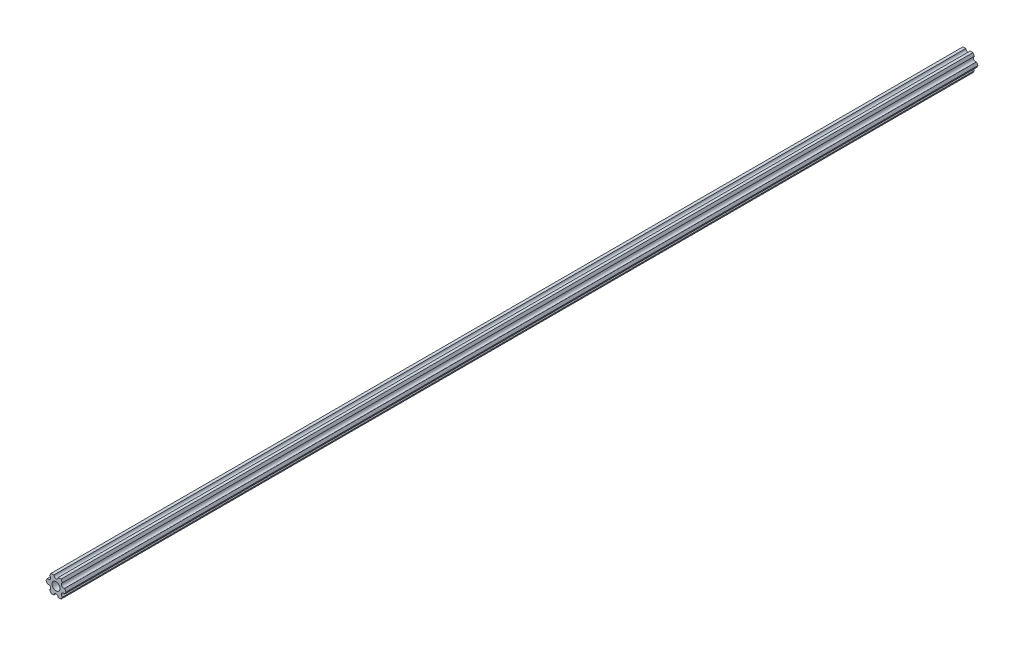
ISO-10303-21;
HEADER;
FILE_DESCRIPTION(('STEP AP214'),'2;1');
FILE_NAME('part.step','',(''),(''),'','','');
FILE_SCHEMA(('AUTOMOTIVE_DESIGN { 1 0 10303 214 1 1 1 1 }'));
ENDSEC;
DATA;
#1=APPLICATION_CONTEXT('core data for automotive mechanical design processes');
#2=APPLICATION_PROTOCOL_DEFINITION('international standard','automotive_design',2000,#1);
#3=PRODUCT_CONTEXT('',#1,'mechanical');
#4=PRODUCT('Part','Part','',(#3));
#5=PRODUCT_RELATED_PRODUCT_CATEGORY('part','',(#4));
#6=PRODUCT_DEFINITION_FORMATION('','',#4);
#7=PRODUCT_DEFINITION_CONTEXT('part definition',#1,'design');
#8=PRODUCT_DEFINITION('design','',#6,#7);
#9=PRODUCT_DEFINITION_SHAPE('','',#8);
#10=(LENGTH_UNIT() NAMED_UNIT(*) SI_UNIT(.MILLI.,.METRE.));
#11=(NAMED_UNIT(*) PLANE_ANGLE_UNIT() SI_UNIT($,.RADIAN.));
#12=(NAMED_UNIT(*) SI_UNIT($,.STERADIAN.) SOLID_ANGLE_UNIT());
#13=UNCERTAINTY_MEASURE_WITH_UNIT(LENGTH_MEASURE(1.E-05),#10,'distance_accuracy_value','');
#14=(GEOMETRIC_REPRESENTATION_CONTEXT(3) GLOBAL_UNCERTAINTY_ASSIGNED_CONTEXT((#13)) GLOBAL_UNIT_ASSIGNED_CONTEXT((#10,
#11,#12)) REPRESENTATION_CONTEXT('',''));
#15=CARTESIAN_POINT('',(0.,0.,0.));
#16=DIRECTION('',(0.,0.,1.));
#17=DIRECTION('',(1.,0.,0.));
#18=AXIS2_PLACEMENT_3D('',#15,#16,#17);
#19=CARTESIAN_POINT('',(5.49926112168156,3.17500033315933,666.75));
#20=DIRECTION('',(0.,0.,1.));
#21=DIRECTION('',(1.,0.,0.));
#22=AXIS2_PLACEMENT_3D('',#19,#20,#21);
#23=PLANE('',#22);
#24=DIRECTION('',(0.499999947533953,0.866025434075723,0.));
#25=VECTOR('',#24,1.);
#26=CARTESIAN_POINT('',(6.29301142309098,-1.80018429024546,666.75));
#27=LINE('',#26,#25);
#28=CARTESIAN_POINT('',(6.29301142309098,-1.80018429024546,666.75));
#29=VERTEX_POINT('',#28);
#30=CARTESIAN_POINT('',(7.33234841870826,4.44212519169686E-07,666.75));
#31=VERTEX_POINT('',#30);
#32=EDGE_CURVE('E227',#29,#31,#27,.T.);
#33=ORIENTED_EDGE('',*,*,#32,.T.);
#34=DIRECTION('',(-0.500000052466056,0.866025373493145,0.));
#35=VECTOR('',#34,1.);
#36=CARTESIAN_POINT('',(7.33234841870826,4.44212519169686E-07,666.75));
#37=LINE('',#36,#35);
#38=CARTESIAN_POINT('',(6.29301120497139,1.80018505273894,666.75));
#39=VERTEX_POINT('',#38);
#40=EDGE_CURVE('E125',#31,#39,#37,.T.);
#41=ORIENTED_EDGE('',*,*,#40,.T.);
#42=CARTESIAN_POINT('',(5.49926112168156,3.17500033315933,666.75));
#43=DIRECTION('',(0.,0.,-1.));
#44=DIRECTION('',(1.,0.,0.));
#45=AXIS2_PLACEMENT_3D('',#42,#43,#44);
#46=CIRCLE('',#45,1.5875);
#47=CARTESIAN_POINT('',(4.70551103839172,4.54981561357972,666.75));
#48=VERTEX_POINT('',#47);
#49=EDGE_CURVE('E272',#39,#48,#46,.T.);
#50=ORIENTED_EDGE('',*,*,#49,.T.);
#51=DIRECTION('',(-0.500000052466046,0.866025373493151,0.));
#52=VECTOR('',#51,1.);
#53=CARTESIAN_POINT('',(4.70551103839172,4.54981561357972,666.75));
#54=LINE('',#53,#52);
#55=CARTESIAN_POINT('',(3.66617382465481,6.35000022210627,666.75));
#56=VERTEX_POINT('',#55);
#57=EDGE_CURVE('E291',#48,#56,#54,.T.);
#58=ORIENTED_EDGE('',*,*,#57,.T.);
#59=DIRECTION('',(-0.999999999999998,-6.05825850611185E-08,0.));
#60=VECTOR('',#59,1.);
#61=CARTESIAN_POINT('',(3.66617382465481,6.35000022210627,666.75));
#62=LINE('',#61,#60);
#63=CARTESIAN_POINT('',(1.58749961530074,6.35000009617482,666.75));
#64=VERTEX_POINT('',#63);
#65=EDGE_CURVE('E288',#56,#64,#62,.T.);
#66=ORIENTED_EDGE('',*,*,#65,.T.);
#67=CARTESIAN_POINT('',(-3.84699260060323E-07,6.35,666.75));
#68=DIRECTION('',(0.,0.,-1.));
#69=DIRECTION('',(1.,0.,0.));
#70=AXIS2_PLACEMENT_3D('',#67,#68,#69);
#71=CIRCLE('',#70,1.5875);
#72=CARTESIAN_POINT('',(-1.58750038469926,6.34999990382518,666.75));
#73=VERTEX_POINT('',#72);
#74=EDGE_CURVE('E290',#64,#73,#71,.T.);
#75=ORIENTED_EDGE('',*,*,#74,.T.);
#76=DIRECTION('',(-0.999999999999998,-6.05825963273174E-08,0.));
#77=VECTOR('',#76,1.);
#78=CARTESIAN_POINT('',(-1.58750038469926,6.34999990382518,666.75));
#79=LINE('',#78,#77);
#80=CARTESIAN_POINT('',(-3.66617459405349,6.3499997778937,666.75));
#81=VERTEX_POINT('',#80);
#82=EDGE_CURVE('E293',#73,#81,#79,.T.);
#83=ORIENTED_EDGE('',*,*,#82,.T.);
#84=DIRECTION('',(-0.499999947533942,-0.866025434075729,0.));
#85=VECTOR('',#84,1.);
#86=CARTESIAN_POINT('',(-3.66617459405349,6.3499997778937,666.75));
#87=LINE('',#86,#85);
#88=CARTESIAN_POINT('',(-4.70551158967065,4.54981504343587,666.75));
#89=VERTEX_POINT('',#88);
#90=EDGE_CURVE('E299',#81,#89,#87,.T.);
#91=ORIENTED_EDGE('',*,*,#90,.T.);
#92=CARTESIAN_POINT('',(-5.49926150638082,3.17499966684067,666.75));
#93=DIRECTION('',(0.,0.,-1.));
#94=DIRECTION('',(1.,0.,0.));
#95=AXIS2_PLACEMENT_3D('',#92,#93,#94);
#96=CIRCLE('',#95,1.5875);
#97=CARTESIAN_POINT('',(-6.29301142309098,1.80018429024547,666.75));
#98=VERTEX_POINT('',#97);
#99=EDGE_CURVE('E301',#89,#98,#96,.T.);
#100=ORIENTED_EDGE('',*,*,#99,.T.);
#101=DIRECTION('',(-0.499999947533951,-0.866025434075724,0.));
#102=VECTOR('',#101,1.);
#103=CARTESIAN_POINT('',(-6.29301142309098,1.80018429024547,666.75));
#104=LINE('',#103,#102);
#105=CARTESIAN_POINT('',(-7.33234841870826,-4.44212523790841E-07,666.75));
#106=VERTEX_POINT('',#105);
#107=EDGE_CURVE('E303',#98,#106,#104,.T.);
#108=ORIENTED_EDGE('',*,*,#107,.T.);
#109=DIRECTION('',(0.500000052466045,-0.866025373493151,0.));
#110=VECTOR('',#109,1.);
#111=CARTESIAN_POINT('',(-7.33234841870826,-4.44212523790841E-07,666.75));
#112=LINE('',#111,#110);
#113=CARTESIAN_POINT('',(-6.29301120497141,-1.80018505273897,666.75));
#114=VERTEX_POINT('',#113);
#115=EDGE_CURVE('E305',#106,#114,#112,.T.);
#116=ORIENTED_EDGE('',*,*,#115,.T.);
#117=CARTESIAN_POINT('',(-5.49926112168156,-3.17500033315934,666.75));
#118=DIRECTION('',(0.,0.,-1.));
#119=DIRECTION('',(1.,0.,0.));
#120=AXIS2_PLACEMENT_3D('',#117,#118,#119);
#121=CIRCLE('',#120,1.5875);
#122=CARTESIAN_POINT('',(-4.70551103839172,-4.54981561357972,666.75));
#123=VERTEX_POINT('',#122);
#124=EDGE_CURVE('E307',#114,#123,#121,.T.);
#125=ORIENTED_EDGE('',*,*,#124,.T.);
#126=DIRECTION('',(0.500000052466045,-0.866025373493151,0.));
#127=VECTOR('',#126,1.);
#128=CARTESIAN_POINT('',(-4.70551103839172,-4.54981561357972,666.75));
#129=LINE('',#128,#127);
#130=CARTESIAN_POINT('',(-3.66617382465481,-6.35000022210628,666.75));
#131=VERTEX_POINT('',#130);
#132=EDGE_CURVE('E309',#123,#131,#129,.T.);
#133=ORIENTED_EDGE('',*,*,#132,.T.);
#134=DIRECTION('',(0.999999999999998,6.05825854783851E-08,0.));
#135=VECTOR('',#134,1.);
#136=CARTESIAN_POINT('',(-3.66617382465481,-6.35000022210628,666.75));
#137=LINE('',#136,#135);
#138=CARTESIAN_POINT('',(-1.58749961530074,-6.35000009617482,666.75));
#139=VERTEX_POINT('',#138);
#140=EDGE_CURVE('E311',#131,#139,#137,.T.);
#141=ORIENTED_EDGE('',*,*,#140,.T.);
#142=CARTESIAN_POINT('',(3.8469926204343E-07,-6.35,666.75));
#143=DIRECTION('',(0.,0.,-1.));
#144=DIRECTION('',(1.,0.,0.));
#145=AXIS2_PLACEMENT_3D('',#142,#143,#144);
#146=CIRCLE('',#145,1.5875);
#147=CARTESIAN_POINT('',(1.58750038469926,-6.34999990382518,666.75));
#148=VERTEX_POINT('',#147);
#149=EDGE_CURVE('E174',#139,#148,#146,.T.);
#150=ORIENTED_EDGE('',*,*,#149,.T.);
#151=DIRECTION('',(0.999999999999998,6.05825721258438E-08,0.));
#152=VECTOR('',#151,1.);
#153=CARTESIAN_POINT('',(1.58750038469926,-6.34999990382518,666.75));
#154=LINE('',#153,#152);
#155=CARTESIAN_POINT('',(3.66617459405346,-6.34999977789375,666.75));
#156=VERTEX_POINT('',#155);
#157=EDGE_CURVE('E168',#148,#156,#154,.T.);
#158=ORIENTED_EDGE('',*,*,#157,.T.);
#159=DIRECTION('',(0.499999947533941,0.86602543407573,0.));
#160=VECTOR('',#159,1.);
#161=CARTESIAN_POINT('',(3.66617459405346,-6.34999977789375,666.75));
#162=LINE('',#161,#160);
#163=CARTESIAN_POINT('',(4.70551158967065,-4.54981504343587,666.75));
#164=VERTEX_POINT('',#163);
#165=EDGE_CURVE('E172',#156,#164,#162,.T.);
#166=ORIENTED_EDGE('',*,*,#165,.T.);
#167=CARTESIAN_POINT('',(5.49926150638082,-3.17499966684067,666.75));
#168=DIRECTION('',(0.,0.,-1.));
#169=DIRECTION('',(1.,0.,0.));
#170=AXIS2_PLACEMENT_3D('',#167,#168,#169);
#171=CIRCLE('',#170,1.58750000000001);
#172=EDGE_CURVE('E52',#164,#29,#171,.T.);
#173=ORIENTED_EDGE('',*,*,#172,.T.);
#174=EDGE_LOOP('',(#33,#41,#50,#58,#66,#75,#83,#91,#100,#108,#116,#125,#133,#141,#150,#158,#166,#173));
#175=FACE_BOUND('',#174,.T.);
#176=CARTESIAN_POINT('',(0.,0.,666.75));
#177=DIRECTION('',(0.,0.,1.));
#178=DIRECTION('',(1.,0.,0.));
#179=AXIS2_PLACEMENT_3D('',#176,#177,#178);
#180=CIRCLE('',#179,2.9337);
#181=CARTESIAN_POINT('',(2.9337,0.,666.75));
#182=VERTEX_POINT('',#181);
#183=EDGE_CURVE('E196',#182,#182,#180,.T.);
#184=ORIENTED_EDGE('',*,*,#183,.F.);
#185=EDGE_LOOP('',(#184));
#186=FACE_BOUND('',#185,.T.);
#187=ADVANCED_FACE('F35',(#175,#186),#23,.T.);
#188=CARTESIAN_POINT('',(5.49926112168156,3.17500033315933,0.));
#189=DIRECTION('',(0.,0.,1.));
#190=DIRECTION('',(1.,0.,0.));
#191=AXIS2_PLACEMENT_3D('',#188,#189,#190);
#192=PLANE('',#191);
#193=DIRECTION('',(0.499999947533953,0.866025434075723,0.));
#194=VECTOR('',#193,1.);
#195=CARTESIAN_POINT('',(6.29301142309098,-1.80018429024546,0.));
#196=LINE('',#195,#194);
#197=CARTESIAN_POINT('',(6.29301142309098,-1.80018429024546,0.));
#198=VERTEX_POINT('',#197);
#199=CARTESIAN_POINT('',(7.33234841870826,4.44212519169686E-07,0.));
#200=VERTEX_POINT('',#199);
#201=EDGE_CURVE('E192',#198,#200,#196,.T.);
#202=ORIENTED_EDGE('',*,*,#201,.F.);
#203=CARTESIAN_POINT('',(5.49926150638082,-3.17499966684067,0.));
#204=DIRECTION('',(0.,0.,-1.));
#205=DIRECTION('',(1.,0.,0.));
#206=AXIS2_PLACEMENT_3D('',#203,#204,#205);
#207=CIRCLE('',#206,1.58750000000001);
#208=CARTESIAN_POINT('',(4.70551158967065,-4.54981504343587,0.));
#209=VERTEX_POINT('',#208);
#210=EDGE_CURVE('E117',#209,#198,#207,.T.);
#211=ORIENTED_EDGE('',*,*,#210,.F.);
#212=DIRECTION('',(0.499999947533941,0.86602543407573,0.));
#213=VECTOR('',#212,1.);
#214=CARTESIAN_POINT('',(3.66617459405346,-6.34999977789375,0.));
#215=LINE('',#214,#213);
#216=CARTESIAN_POINT('',(3.66617459405346,-6.34999977789375,0.));
#217=VERTEX_POINT('',#216);
#218=EDGE_CURVE('E111',#217,#209,#215,.T.);
#219=ORIENTED_EDGE('',*,*,#218,.F.);
#220=DIRECTION('',(0.999999999999998,6.05825721258438E-08,0.));
#221=VECTOR('',#220,1.);
#222=CARTESIAN_POINT('',(1.58750038469926,-6.34999990382518,0.));
#223=LINE('',#222,#221);
#224=CARTESIAN_POINT('',(1.58750038469926,-6.34999990382518,0.));
#225=VERTEX_POINT('',#224);
#226=EDGE_CURVE('E182',#225,#217,#223,.T.);
#227=ORIENTED_EDGE('',*,*,#226,.F.);
#228=CARTESIAN_POINT('',(3.8469926204343E-07,-6.35,0.));
#229=DIRECTION('',(0.,0.,-1.));
#230=DIRECTION('',(1.,0.,0.));
#231=AXIS2_PLACEMENT_3D('',#228,#229,#230);
#232=CIRCLE('',#231,1.5875);
#233=CARTESIAN_POINT('',(-1.58749961530074,-6.35000009617482,0.));
#234=VERTEX_POINT('',#233);
#235=EDGE_CURVE('E222',#234,#225,#232,.T.);
#236=ORIENTED_EDGE('',*,*,#235,.F.);
#237=DIRECTION('',(0.999999999999998,6.05825854783851E-08,0.));
#238=VECTOR('',#237,1.);
#239=CARTESIAN_POINT('',(-3.66617382465481,-6.35000022210628,0.));
#240=LINE('',#239,#238);
#241=CARTESIAN_POINT('',(-3.66617382465481,-6.35000022210628,0.));
#242=VERTEX_POINT('',#241);
#243=EDGE_CURVE('E220',#242,#234,#240,.T.);
#244=ORIENTED_EDGE('',*,*,#243,.F.);
#245=DIRECTION('',(0.500000052466045,-0.866025373493151,0.));
#246=VECTOR('',#245,1.);
#247=CARTESIAN_POINT('',(-4.70551103839172,-4.54981561357972,0.));
#248=LINE('',#247,#246);
#249=CARTESIAN_POINT('',(-4.70551103839172,-4.54981561357972,0.));
#250=VERTEX_POINT('',#249);
#251=EDGE_CURVE('E218',#250,#242,#248,.T.);
#252=ORIENTED_EDGE('',*,*,#251,.F.);
#253=CARTESIAN_POINT('',(-5.49926112168156,-3.17500033315934,0.));
#254=DIRECTION('',(0.,0.,-1.));
#255=DIRECTION('',(1.,0.,0.));
#256=AXIS2_PLACEMENT_3D('',#253,#254,#255);
#257=CIRCLE('',#256,1.5875);
#258=CARTESIAN_POINT('',(-6.29301120497141,-1.80018505273897,0.));
#259=VERTEX_POINT('',#258);
#260=EDGE_CURVE('E216',#259,#250,#257,.T.);
#261=ORIENTED_EDGE('',*,*,#260,.F.);
#262=DIRECTION('',(0.500000052466045,-0.866025373493151,0.));
#263=VECTOR('',#262,1.);
#264=CARTESIAN_POINT('',(-7.33234841870826,-4.44212523790841E-07,0.));
#265=LINE('',#264,#263);
#266=CARTESIAN_POINT('',(-7.33234841870826,-4.44212523790841E-07,0.));
#267=VERTEX_POINT('',#266);
#268=EDGE_CURVE('E214',#267,#259,#265,.T.);
#269=ORIENTED_EDGE('',*,*,#268,.F.);
#270=DIRECTION('',(-0.499999947533951,-0.866025434075724,0.));
#271=VECTOR('',#270,1.);
#272=CARTESIAN_POINT('',(-6.29301142309098,1.80018429024547,0.));
#273=LINE('',#272,#271);
#274=CARTESIAN_POINT('',(-6.29301142309098,1.80018429024547,0.));
#275=VERTEX_POINT('',#274);
#276=EDGE_CURVE('E212',#275,#267,#273,.T.);
#277=ORIENTED_EDGE('',*,*,#276,.F.);
#278=CARTESIAN_POINT('',(-5.49926150638082,3.17499966684067,0.));
#279=DIRECTION('',(0.,0.,-1.));
#280=DIRECTION('',(1.,0.,0.));
#281=AXIS2_PLACEMENT_3D('',#278,#279,#280);
#282=CIRCLE('',#281,1.5875);
#283=CARTESIAN_POINT('',(-4.70551158967065,4.54981504343587,0.));
#284=VERTEX_POINT('',#283);
#285=EDGE_CURVE('E210',#284,#275,#282,.T.);
#286=ORIENTED_EDGE('',*,*,#285,.F.);
#287=DIRECTION('',(-0.499999947533942,-0.866025434075729,0.));
#288=VECTOR('',#287,1.);
#289=CARTESIAN_POINT('',(-3.66617459405349,6.3499997778937,0.));
#290=LINE('',#289,#288);
#291=CARTESIAN_POINT('',(-3.66617459405349,6.3499997778937,0.));
#292=VERTEX_POINT('',#291);
#293=EDGE_CURVE('E208',#292,#284,#290,.T.);
#294=ORIENTED_EDGE('',*,*,#293,.F.);
#295=DIRECTION('',(-0.999999999999998,-6.05825963273174E-08,0.));
#296=VECTOR('',#295,1.);
#297=CARTESIAN_POINT('',(-1.58750038469926,6.34999990382518,0.));
#298=LINE('',#297,#296);
#299=CARTESIAN_POINT('',(-1.58750038469926,6.34999990382518,0.));
#300=VERTEX_POINT('',#299);
#301=EDGE_CURVE('E206',#300,#292,#298,.T.);
#302=ORIENTED_EDGE('',*,*,#301,.F.);
#303=CARTESIAN_POINT('',(-3.84699260060323E-07,6.35,0.));
#304=DIRECTION('',(0.,0.,-1.));
#305=DIRECTION('',(1.,0.,0.));
#306=AXIS2_PLACEMENT_3D('',#303,#304,#305);
#307=CIRCLE('',#306,1.5875);
#308=CARTESIAN_POINT('',(1.58749961530074,6.35000009617482,0.));
#309=VERTEX_POINT('',#308);
#310=EDGE_CURVE('E204',#309,#300,#307,.T.);
#311=ORIENTED_EDGE('',*,*,#310,.F.);
#312=DIRECTION('',(-0.999999999999998,-6.05825850611185E-08,0.));
#313=VECTOR('',#312,1.);
#314=CARTESIAN_POINT('',(3.66617382465481,6.35000022210627,0.));
#315=LINE('',#314,#313);
#316=CARTESIAN_POINT('',(3.66617382465481,6.35000022210627,0.));
#317=VERTEX_POINT('',#316);
#318=EDGE_CURVE('E202',#317,#309,#315,.T.);
#319=ORIENTED_EDGE('',*,*,#318,.F.);
#320=DIRECTION('',(-0.500000052466046,0.866025373493151,0.));
#321=VECTOR('',#320,1.);
#322=CARTESIAN_POINT('',(4.70551103839172,4.54981561357972,0.));
#323=LINE('',#322,#321);
#324=CARTESIAN_POINT('',(4.70551103839172,4.54981561357972,0.));
#325=VERTEX_POINT('',#324);
#326=EDGE_CURVE('E200',#325,#317,#323,.T.);
#327=ORIENTED_EDGE('',*,*,#326,.F.);
#328=CARTESIAN_POINT('',(5.49926112168156,3.17500033315933,0.));
#329=DIRECTION('',(0.,0.,-1.));
#330=DIRECTION('',(1.,0.,0.));
#331=AXIS2_PLACEMENT_3D('',#328,#329,#330);
#332=CIRCLE('',#331,1.5875);
#333=CARTESIAN_POINT('',(6.29301120497139,1.80018505273894,0.));
#334=VERTEX_POINT('',#333);
#335=EDGE_CURVE('E198',#334,#325,#332,.T.);
#336=ORIENTED_EDGE('',*,*,#335,.F.);
#337=DIRECTION('',(-0.500000052466056,0.866025373493145,0.));
#338=VECTOR('',#337,1.);
#339=CARTESIAN_POINT('',(7.33234841870826,4.44212519169686E-07,0.));
#340=LINE('',#339,#338);
#341=EDGE_CURVE('E195',#200,#334,#340,.T.);
#342=ORIENTED_EDGE('',*,*,#341,.F.);
#343=EDGE_LOOP('',(#202,#211,#219,#227,#236,#244,#252,#261,#269,#277,#286,#294,#302,#311,#319,
#327,#336,#342));
#344=FACE_BOUND('',#343,.T.);
#345=CARTESIAN_POINT('',(0.,0.,0.));
#346=DIRECTION('',(0.,0.,1.));
#347=DIRECTION('',(1.,0.,0.));
#348=AXIS2_PLACEMENT_3D('',#345,#346,#347);
#349=CIRCLE('',#348,2.9337);
#350=CARTESIAN_POINT('',(2.9337,0.,0.));
#351=VERTEX_POINT('',#350);
#352=EDGE_CURVE('E536',#351,#351,#349,.T.);
#353=ORIENTED_EDGE('',*,*,#352,.T.);
#354=EDGE_LOOP('',(#353));
#355=FACE_BOUND('',#354,.T.);
#356=ADVANCED_FACE('F276',(#344,#355),#192,.F.);
#357=CARTESIAN_POINT('',(6.29301142309098,-1.80018429024546,666.75));
#358=DIRECTION('',(-0.866025434075723,0.499999947533953,0.));
#359=DIRECTION('',(-0.499999947533953,-0.866025434075723,0.));
#360=AXIS2_PLACEMENT_3D('',#357,#358,#359);
#361=PLANE('',#360);
#362=ORIENTED_EDGE('',*,*,#201,.T.);
#363=DIRECTION('',(0.,0.,-1.));
#364=VECTOR('',#363,1.);
#365=CARTESIAN_POINT('',(7.33234841870826,4.44212519169686E-07,666.75));
#366=LINE('',#365,#364);
#367=EDGE_CURVE('E11',#31,#200,#366,.T.);
#368=ORIENTED_EDGE('',*,*,#367,.F.);
#369=ORIENTED_EDGE('',*,*,#32,.F.);
#370=DIRECTION('',(0.,0.,-1.));
#371=VECTOR('',#370,1.);
#372=CARTESIAN_POINT('',(6.29301142309098,-1.80018429024546,666.75));
#373=LINE('',#372,#371);
#374=EDGE_CURVE('E188',#29,#198,#373,.T.);
#375=ORIENTED_EDGE('',*,*,#374,.T.);
#376=EDGE_LOOP('',(#362,#368,#369,#375));
#377=FACE_BOUND('',#376,.T.);
#378=ADVANCED_FACE('F37',(#377),#361,.F.);
#379=CARTESIAN_POINT('',(7.33234841870826,4.44212519169686E-07,666.75));
#380=DIRECTION('',(-0.866025373493145,-0.500000052466056,0.));
#381=DIRECTION('',(0.500000052466056,-0.866025373493145,0.));
#382=AXIS2_PLACEMENT_3D('',#379,#380,#381);
#383=PLANE('',#382);
#384=ORIENTED_EDGE('',*,*,#341,.T.);
#385=DIRECTION('',(0.,0.,-1.));
#386=VECTOR('',#385,1.);
#387=CARTESIAN_POINT('',(6.29301120497139,1.80018505273894,666.75));
#388=LINE('',#387,#386);
#389=EDGE_CURVE('E44',#39,#334,#388,.T.);
#390=ORIENTED_EDGE('',*,*,#389,.F.);
#391=ORIENTED_EDGE('',*,*,#40,.F.);
#392=ORIENTED_EDGE('',*,*,#367,.T.);
#393=EDGE_LOOP('',(#384,#390,#391,#392));
#394=FACE_BOUND('',#393,.T.);
#395=ADVANCED_FACE('F345',(#394),#383,.F.);
#396=CARTESIAN_POINT('',(5.49926112168156,3.17500033315933,666.75));
#397=DIRECTION('',(0.,0.,-1.));
#398=DIRECTION('',(-1.,0.,0.));
#399=AXIS2_PLACEMENT_3D('',#396,#397,#398);
#400=CYLINDRICAL_SURFACE('',#399,1.5875);
#401=ORIENTED_EDGE('',*,*,#335,.T.);
#402=DIRECTION('',(0.,0.,-1.));
#403=VECTOR('',#402,1.);
#404=CARTESIAN_POINT('',(4.70551103839172,4.54981561357972,666.75));
#405=LINE('',#404,#403);
#406=EDGE_CURVE('E264',#48,#325,#405,.T.);
#407=ORIENTED_EDGE('',*,*,#406,.F.);
#408=ORIENTED_EDGE('',*,*,#49,.F.);
#409=ORIENTED_EDGE('',*,*,#389,.T.);
#410=EDGE_LOOP('',(#401,#407,#408,#409));
#411=FACE_BOUND('',#410,.T.);
#412=ADVANCED_FACE('F270',(#411),#400,.F.);
#413=CARTESIAN_POINT('',(4.70551103839172,4.54981561357972,666.75));
#414=DIRECTION('',(-0.866025373493151,-0.500000052466046,0.));
#415=DIRECTION('',(0.500000052466046,-0.866025373493151,0.));
#416=AXIS2_PLACEMENT_3D('',#413,#414,#415);
#417=PLANE('',#416);
#418=ORIENTED_EDGE('',*,*,#326,.T.);
#419=DIRECTION('',(0.,0.,-1.));
#420=VECTOR('',#419,1.);
#421=CARTESIAN_POINT('',(3.66617382465481,6.35000022210627,666.75));
#422=LINE('',#421,#420);
#423=EDGE_CURVE('E261',#56,#317,#422,.T.);
#424=ORIENTED_EDGE('',*,*,#423,.F.);
#425=ORIENTED_EDGE('',*,*,#57,.F.);
#426=ORIENTED_EDGE('',*,*,#406,.T.);
#427=EDGE_LOOP('',(#418,#424,#425,#426));
#428=FACE_BOUND('',#427,.T.);
#429=ADVANCED_FACE('F282',(#428),#417,.F.);
#430=CARTESIAN_POINT('',(3.66617382465481,6.35000022210627,666.75));
#431=DIRECTION('',(6.05825850611185E-08,-0.999999999999998,0.));
#432=DIRECTION('',(0.999999999999998,6.05825850611185E-08,0.));
#433=AXIS2_PLACEMENT_3D('',#430,#431,#432);
#434=PLANE('',#433);
#435=ORIENTED_EDGE('',*,*,#318,.T.);
#436=DIRECTION('',(0.,0.,-1.));
#437=VECTOR('',#436,1.);
#438=CARTESIAN_POINT('',(1.58749961530074,6.35000009617482,666.75));
#439=LINE('',#438,#437);
#440=EDGE_CURVE('E258',#64,#309,#439,.T.);
#441=ORIENTED_EDGE('',*,*,#440,.F.);
#442=ORIENTED_EDGE('',*,*,#65,.F.);
#443=ORIENTED_EDGE('',*,*,#423,.T.);
#444=EDGE_LOOP('',(#435,#441,#442,#443));
#445=FACE_BOUND('',#444,.T.);
#446=ADVANCED_FACE('F286',(#445),#434,.F.);
#447=CARTESIAN_POINT('',(-3.84699260060323E-07,6.35,666.75));
#448=DIRECTION('',(0.,0.,-1.));
#449=DIRECTION('',(-1.,0.,0.));
#450=AXIS2_PLACEMENT_3D('',#447,#448,#449);
#451=CYLINDRICAL_SURFACE('',#450,1.5875);
#452=ORIENTED_EDGE('',*,*,#310,.T.);
#453=DIRECTION('',(0.,0.,-1.));
#454=VECTOR('',#453,1.);
#455=CARTESIAN_POINT('',(-1.58750038469926,6.34999990382518,666.75));
#456=LINE('',#455,#454);
#457=EDGE_CURVE('E255',#73,#300,#456,.T.);
#458=ORIENTED_EDGE('',*,*,#457,.F.);
#459=ORIENTED_EDGE('',*,*,#74,.F.);
#460=ORIENTED_EDGE('',*,*,#440,.T.);
#461=EDGE_LOOP('',(#452,#458,#459,#460));
#462=FACE_BOUND('',#461,.T.);
#463=ADVANCED_FACE('F358',(#462),#451,.F.);
#464=CARTESIAN_POINT('',(-1.58750038469926,6.34999990382518,666.75));
#465=DIRECTION('',(6.05825963273174E-08,-0.999999999999998,0.));
#466=DIRECTION('',(0.999999999999998,6.05825963273174E-08,0.));
#467=AXIS2_PLACEMENT_3D('',#464,#465,#466);
#468=PLANE('',#467);
#469=ORIENTED_EDGE('',*,*,#301,.T.);
#470=DIRECTION('',(0.,0.,-1.));
#471=VECTOR('',#470,1.);
#472=CARTESIAN_POINT('',(-3.66617459405349,6.3499997778937,666.75));
#473=LINE('',#472,#471);
#474=EDGE_CURVE('E252',#81,#292,#473,.T.);
#475=ORIENTED_EDGE('',*,*,#474,.F.);
#476=ORIENTED_EDGE('',*,*,#82,.F.);
#477=ORIENTED_EDGE('',*,*,#457,.T.);
#478=EDGE_LOOP('',(#469,#475,#476,#477));
#479=FACE_BOUND('',#478,.T.);
#480=ADVANCED_FACE('F361',(#479),#468,.F.);
#481=CARTESIAN_POINT('',(-3.66617459405349,6.3499997778937,666.75));
#482=DIRECTION('',(0.866025434075729,-0.499999947533942,0.));
#483=DIRECTION('',(0.499999947533943,0.866025434075729,0.));
#484=AXIS2_PLACEMENT_3D('',#481,#482,#483);
#485=PLANE('',#484);
#486=ORIENTED_EDGE('',*,*,#293,.T.);
#487=DIRECTION('',(0.,0.,-1.));
#488=VECTOR('',#487,1.);
#489=CARTESIAN_POINT('',(-4.70551158967065,4.54981504343587,666.75));
#490=LINE('',#489,#488);
#491=EDGE_CURVE('E249',#89,#284,#490,.T.);
#492=ORIENTED_EDGE('',*,*,#491,.F.);
#493=ORIENTED_EDGE('',*,*,#90,.F.);
#494=ORIENTED_EDGE('',*,*,#474,.T.);
#495=EDGE_LOOP('',(#486,#492,#493,#494));
#496=FACE_BOUND('',#495,.T.);
#497=ADVANCED_FACE('F365',(#496),#485,.F.);
#498=CARTESIAN_POINT('',(-5.49926150638082,3.17499966684067,666.75));
#499=DIRECTION('',(0.,0.,-1.));
#500=DIRECTION('',(-1.,0.,0.));
#501=AXIS2_PLACEMENT_3D('',#498,#499,#500);
#502=CYLINDRICAL_SURFACE('',#501,1.5875);
#503=ORIENTED_EDGE('',*,*,#285,.T.);
#504=DIRECTION('',(0.,0.,-1.));
#505=VECTOR('',#504,1.);
#506=CARTESIAN_POINT('',(-6.29301142309098,1.80018429024547,666.75));
#507=LINE('',#506,#505);
#508=EDGE_CURVE('E246',#98,#275,#507,.T.);
#509=ORIENTED_EDGE('',*,*,#508,.F.);
#510=ORIENTED_EDGE('',*,*,#99,.F.);
#511=ORIENTED_EDGE('',*,*,#491,.T.);
#512=EDGE_LOOP('',(#503,#509,#510,#511));
#513=FACE_BOUND('',#512,.T.);
#514=ADVANCED_FACE('F369',(#513),#502,.F.);
#515=CARTESIAN_POINT('',(-6.29301142309098,1.80018429024547,666.75));
#516=DIRECTION('',(0.866025434075724,-0.499999947533951,0.));
#517=DIRECTION('',(0.499999947533951,0.866025434075724,0.));
#518=AXIS2_PLACEMENT_3D('',#515,#516,#517);
#519=PLANE('',#518);
#520=ORIENTED_EDGE('',*,*,#276,.T.);
#521=DIRECTION('',(0.,0.,-1.));
#522=VECTOR('',#521,1.);
#523=CARTESIAN_POINT('',(-7.33234841870826,-4.44212523790841E-07,666.75));
#524=LINE('',#523,#522);
#525=EDGE_CURVE('E243',#106,#267,#524,.T.);
#526=ORIENTED_EDGE('',*,*,#525,.F.);
#527=ORIENTED_EDGE('',*,*,#107,.F.);
#528=ORIENTED_EDGE('',*,*,#508,.T.);
#529=EDGE_LOOP('',(#520,#526,#527,#528));
#530=FACE_BOUND('',#529,.T.);
#531=ADVANCED_FACE('F373',(#530),#519,.F.);
#532=CARTESIAN_POINT('',(-7.33234841870826,-4.44212523790841E-07,666.75));
#533=DIRECTION('',(0.866025373493151,0.500000052466045,0.));
#534=DIRECTION('',(-0.500000052466045,0.866025373493151,0.));
#535=AXIS2_PLACEMENT_3D('',#532,#533,#534);
#536=PLANE('',#535);
#537=ORIENTED_EDGE('',*,*,#268,.T.);
#538=DIRECTION('',(0.,0.,-1.));
#539=VECTOR('',#538,1.);
#540=CARTESIAN_POINT('',(-6.29301120497141,-1.80018505273897,666.75));
#541=LINE('',#540,#539);
#542=EDGE_CURVE('E240',#114,#259,#541,.T.);
#543=ORIENTED_EDGE('',*,*,#542,.F.);
#544=ORIENTED_EDGE('',*,*,#115,.F.);
#545=ORIENTED_EDGE('',*,*,#525,.T.);
#546=EDGE_LOOP('',(#537,#543,#544,#545));
#547=FACE_BOUND('',#546,.T.);
#548=ADVANCED_FACE('F377',(#547),#536,.F.);
#549=CARTESIAN_POINT('',(-5.49926112168156,-3.17500033315934,666.75));
#550=DIRECTION('',(0.,0.,-1.));
#551=DIRECTION('',(-1.,0.,0.));
#552=AXIS2_PLACEMENT_3D('',#549,#550,#551);
#553=CYLINDRICAL_SURFACE('',#552,1.5875);
#554=ORIENTED_EDGE('',*,*,#260,.T.);
#555=DIRECTION('',(0.,0.,-1.));
#556=VECTOR('',#555,1.);
#557=CARTESIAN_POINT('',(-4.70551103839172,-4.54981561357972,666.75));
#558=LINE('',#557,#556);
#559=EDGE_CURVE('E237',#123,#250,#558,.T.);
#560=ORIENTED_EDGE('',*,*,#559,.F.);
#561=ORIENTED_EDGE('',*,*,#124,.F.);
#562=ORIENTED_EDGE('',*,*,#542,.T.);
#563=EDGE_LOOP('',(#554,#560,#561,#562));
#564=FACE_BOUND('',#563,.T.);
#565=ADVANCED_FACE('F381',(#564),#553,.F.);
#566=CARTESIAN_POINT('',(-4.70551103839172,-4.54981561357972,666.75));
#567=DIRECTION('',(0.866025373493151,0.500000052466045,0.));
#568=DIRECTION('',(-0.500000052466045,0.866025373493152,0.));
#569=AXIS2_PLACEMENT_3D('',#566,#567,#568);
#570=PLANE('',#569);
#571=ORIENTED_EDGE('',*,*,#251,.T.);
#572=DIRECTION('',(0.,0.,-1.));
#573=VECTOR('',#572,1.);
#574=CARTESIAN_POINT('',(-3.66617382465481,-6.35000022210628,666.75));
#575=LINE('',#574,#573);
#576=EDGE_CURVE('E234',#131,#242,#575,.T.);
#577=ORIENTED_EDGE('',*,*,#576,.F.);
#578=ORIENTED_EDGE('',*,*,#132,.F.);
#579=ORIENTED_EDGE('',*,*,#559,.T.);
#580=EDGE_LOOP('',(#571,#577,#578,#579));
#581=FACE_BOUND('',#580,.T.);
#582=ADVANCED_FACE('F385',(#581),#570,.F.);
#583=CARTESIAN_POINT('',(-3.66617382465481,-6.35000022210628,666.75));
#584=DIRECTION('',(-6.05825854783851E-08,0.999999999999998,0.));
#585=DIRECTION('',(-0.999999999999998,-6.05825854783851E-08,0.));
#586=AXIS2_PLACEMENT_3D('',#583,#584,#585);
#587=PLANE('',#586);
#588=ORIENTED_EDGE('',*,*,#243,.T.);
#589=DIRECTION('',(0.,0.,-1.));
#590=VECTOR('',#589,1.);
#591=CARTESIAN_POINT('',(-1.58749961530074,-6.35000009617482,666.75));
#592=LINE('',#591,#590);
#593=EDGE_CURVE('E231',#139,#234,#592,.T.);
#594=ORIENTED_EDGE('',*,*,#593,.F.);
#595=ORIENTED_EDGE('',*,*,#140,.F.);
#596=ORIENTED_EDGE('',*,*,#576,.T.);
#597=EDGE_LOOP('',(#588,#594,#595,#596));
#598=FACE_BOUND('',#597,.T.);
#599=ADVANCED_FACE('F317',(#598),#587,.F.);
#600=CARTESIAN_POINT('',(3.8469926204343E-07,-6.35,666.75));
#601=DIRECTION('',(0.,0.,-1.));
#602=DIRECTION('',(-1.,0.,0.));
#603=AXIS2_PLACEMENT_3D('',#600,#601,#602);
#604=CYLINDRICAL_SURFACE('',#603,1.5875);
#605=ORIENTED_EDGE('',*,*,#235,.T.);
#606=DIRECTION('',(0.,0.,-1.));
#607=VECTOR('',#606,1.);
#608=CARTESIAN_POINT('',(1.58750038469926,-6.34999990382518,666.75));
#609=LINE('',#608,#607);
#610=EDGE_CURVE('E183',#148,#225,#609,.T.);
#611=ORIENTED_EDGE('',*,*,#610,.F.);
#612=ORIENTED_EDGE('',*,*,#149,.F.);
#613=ORIENTED_EDGE('',*,*,#593,.T.);
#614=EDGE_LOOP('',(#605,#611,#612,#613));
#615=FACE_BOUND('',#614,.T.);
#616=ADVANCED_FACE('F321',(#615),#604,.F.);
#617=CARTESIAN_POINT('',(1.58750038469926,-6.34999990382518,666.75));
#618=DIRECTION('',(-6.05825721258438E-08,0.999999999999998,0.));
#619=DIRECTION('',(-0.999999999999998,-6.05825721258438E-08,0.));
#620=AXIS2_PLACEMENT_3D('',#617,#618,#619);
#621=PLANE('',#620);
#622=ORIENTED_EDGE('',*,*,#226,.T.);
#623=DIRECTION('',(0.,0.,-1.));
#624=VECTOR('',#623,1.);
#625=CARTESIAN_POINT('',(3.66617459405346,-6.34999977789375,666.75));
#626=LINE('',#625,#624);
#627=EDGE_CURVE('E179',#156,#217,#626,.T.);
#628=ORIENTED_EDGE('',*,*,#627,.F.);
#629=ORIENTED_EDGE('',*,*,#157,.F.);
#630=ORIENTED_EDGE('',*,*,#610,.T.);
#631=EDGE_LOOP('',(#622,#628,#629,#630));
#632=FACE_BOUND('',#631,.T.);
#633=ADVANCED_FACE('F180',(#632),#621,.F.);
#634=CARTESIAN_POINT('',(3.66617459405346,-6.34999977789375,666.75));
#635=DIRECTION('',(-0.86602543407573,0.499999947533941,0.));
#636=DIRECTION('',(-0.499999947533941,-0.86602543407573,0.));
#637=AXIS2_PLACEMENT_3D('',#634,#635,#636);
#638=PLANE('',#637);
#639=ORIENTED_EDGE('',*,*,#218,.T.);
#640=DIRECTION('',(0.,0.,-1.));
#641=VECTOR('',#640,1.);
#642=CARTESIAN_POINT('',(4.70551158967065,-4.54981504343587,666.75));
#643=LINE('',#642,#641);
#644=EDGE_CURVE('E184',#164,#209,#643,.T.);
#645=ORIENTED_EDGE('',*,*,#644,.F.);
#646=ORIENTED_EDGE('',*,*,#165,.F.);
#647=ORIENTED_EDGE('',*,*,#627,.T.);
#648=EDGE_LOOP('',(#639,#645,#646,#647));
#649=FACE_BOUND('',#648,.T.);
#650=ADVANCED_FACE('F186',(#649),#638,.F.);
#651=CARTESIAN_POINT('',(5.49926150638082,-3.17499966684067,666.75));
#652=DIRECTION('',(0.,0.,-1.));
#653=DIRECTION('',(-1.,0.,0.));
#654=AXIS2_PLACEMENT_3D('',#651,#652,#653);
#655=CYLINDRICAL_SURFACE('',#654,1.58750000000001);
#656=ORIENTED_EDGE('',*,*,#210,.T.);
#657=ORIENTED_EDGE('',*,*,#374,.F.);
#658=ORIENTED_EDGE('',*,*,#172,.F.);
#659=ORIENTED_EDGE('',*,*,#644,.T.);
#660=EDGE_LOOP('',(#656,#657,#658,#659));
#661=FACE_BOUND('',#660,.T.);
#662=ADVANCED_FACE('F325',(#661),#655,.F.);
#663=CARTESIAN_POINT('',(0.,0.,666.75));
#664=DIRECTION('',(0.,0.,-1.));
#665=DIRECTION('',(-1.,0.,0.));
#666=AXIS2_PLACEMENT_3D('',#663,#664,#665);
#667=CYLINDRICAL_SURFACE('',#666,2.9337);
#668=ORIENTED_EDGE('',*,*,#183,.T.);
#669=EDGE_LOOP('',(#668));
#670=FACE_BOUND('',#669,.T.);
#671=ORIENTED_EDGE('',*,*,#352,.F.);
#672=EDGE_LOOP('',(#671));
#673=FACE_BOUND('',#672,.T.);
#674=ADVANCED_FACE('F327',(#670,#673),#667,.F.);
#675=CLOSED_SHELL('',(#187,#356,#378,#395,#412,#429,#446,#463,#480,#497,#514,#531,#548,#565,
#582,#599,#616,#633,#650,#662,#674));
#676=MANIFOLD_SOLID_BREP('B2',#675);
#677=ADVANCED_BREP_SHAPE_REPRESENTATION('',(#18,#676),#14);
#678=SHAPE_DEFINITION_REPRESENTATION(#9,#677);
ENDSEC;
END-ISO-10303-21;
